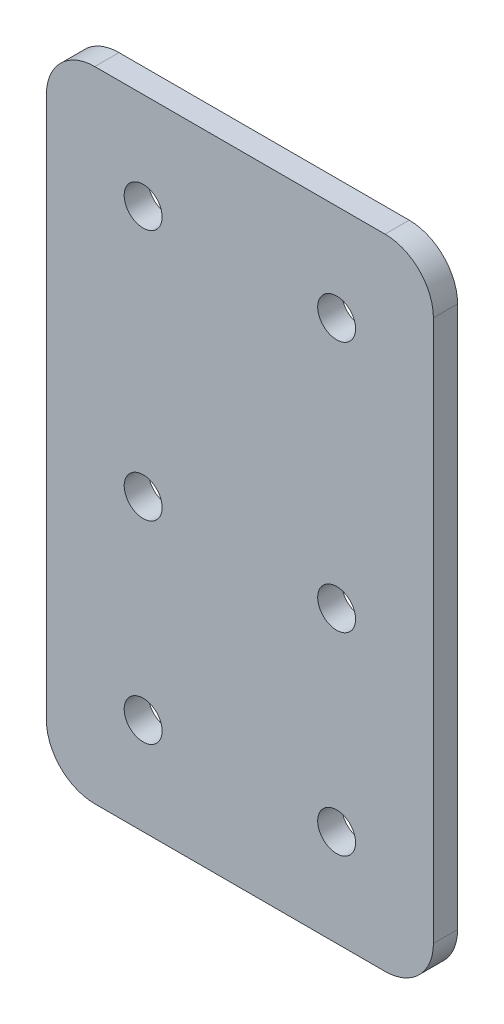
ISO-10303-21;
HEADER;
FILE_DESCRIPTION(('STEP AP214'),'2;1');
FILE_NAME('part.step','',(''),(''),'','','');
FILE_SCHEMA(('AUTOMOTIVE_DESIGN { 1 0 10303 214 1 1 1 1 }'));
ENDSEC;
DATA;
#1=APPLICATION_CONTEXT('core data for automotive mechanical design processes');
#2=APPLICATION_PROTOCOL_DEFINITION('international standard','automotive_design',2000,#1);
#3=PRODUCT_CONTEXT('',#1,'mechanical');
#4=PRODUCT('Part','Part','',(#3));
#5=PRODUCT_RELATED_PRODUCT_CATEGORY('part','',(#4));
#6=PRODUCT_DEFINITION_FORMATION('','',#4);
#7=PRODUCT_DEFINITION_CONTEXT('part definition',#1,'design');
#8=PRODUCT_DEFINITION('design','',#6,#7);
#9=PRODUCT_DEFINITION_SHAPE('','',#8);
#10=(LENGTH_UNIT() NAMED_UNIT(*) SI_UNIT(.MILLI.,.METRE.));
#11=(NAMED_UNIT(*) PLANE_ANGLE_UNIT() SI_UNIT($,.RADIAN.));
#12=(NAMED_UNIT(*) SI_UNIT($,.STERADIAN.) SOLID_ANGLE_UNIT());
#13=UNCERTAINTY_MEASURE_WITH_UNIT(LENGTH_MEASURE(1.E-05),#10,'distance_accuracy_value','');
#14=(GEOMETRIC_REPRESENTATION_CONTEXT(3) GLOBAL_UNCERTAINTY_ASSIGNED_CONTEXT((#13)) GLOBAL_UNIT_ASSIGNED_CONTEXT((#10,
#11,#12)) REPRESENTATION_CONTEXT('',''));
#15=CARTESIAN_POINT('',(0.,0.,0.));
#16=DIRECTION('',(0.,0.,1.));
#17=DIRECTION('',(1.,0.,0.));
#18=AXIS2_PLACEMENT_3D('',#15,#16,#17);
#19=CARTESIAN_POINT('',(0.,0.,-3.175));
#20=DIRECTION('',(-1.,0.,0.));
#21=DIRECTION('',(0.,0.,1.));
#22=AXIS2_PLACEMENT_3D('',#19,#20,#21);
#23=PLANE('',#22);
#24=DIRECTION('',(0.,-1.,0.));
#25=VECTOR('',#24,1.);
#26=CARTESIAN_POINT('',(0.,0.,-3.175));
#27=LINE('',#26,#25);
#28=CARTESIAN_POINT('',(0.,77.47,-3.175));
#29=VERTEX_POINT('',#28);
#30=CARTESIAN_POINT('',(0.,6.35,-3.175));
#31=VERTEX_POINT('',#30);
#32=EDGE_CURVE('E196',#29,#31,#27,.T.);
#33=ORIENTED_EDGE('',*,*,#32,.T.);
#34=DIRECTION('',(0.,0.,1.));
#35=VECTOR('',#34,1.);
#36=CARTESIAN_POINT('',(0.,6.35,-3.175));
#37=LINE('',#36,#35);
#38=CARTESIAN_POINT('',(0.,6.35,0.));
#39=VERTEX_POINT('',#38);
#40=EDGE_CURVE('E132',#31,#39,#37,.T.);
#41=ORIENTED_EDGE('',*,*,#40,.T.);
#42=DIRECTION('',(0.,-1.,0.));
#43=VECTOR('',#42,1.);
#44=CARTESIAN_POINT('',(0.,0.,0.));
#45=LINE('',#44,#43);
#46=CARTESIAN_POINT('',(0.,77.47,0.));
#47=VERTEX_POINT('',#46);
#48=EDGE_CURVE('E116',#47,#39,#45,.T.);
#49=ORIENTED_EDGE('',*,*,#48,.F.);
#50=DIRECTION('',(0.,0.,1.));
#51=VECTOR('',#50,1.);
#52=CARTESIAN_POINT('',(0.,77.47,-3.175));
#53=LINE('',#52,#51);
#54=EDGE_CURVE('E129',#47,#29,#53,.F.);
#55=ORIENTED_EDGE('',*,*,#54,.T.);
#56=EDGE_LOOP('',(#33,#41,#49,#55));
#57=FACE_BOUND('',#56,.T.);
#58=ADVANCED_FACE('F45',(#57),#23,.T.);
#59=CARTESIAN_POINT('',(0.,83.82,-3.175));
#60=DIRECTION('',(0.,1.,0.));
#61=DIRECTION('',(0.,0.,1.));
#62=AXIS2_PLACEMENT_3D('',#59,#60,#61);
#63=PLANE('',#62);
#64=DIRECTION('',(-1.,0.,0.));
#65=VECTOR('',#64,1.);
#66=CARTESIAN_POINT('',(0.,83.82,-3.175));
#67=LINE('',#66,#65);
#68=CARTESIAN_POINT('',(44.45,83.82,-3.175));
#69=VERTEX_POINT('',#68);
#70=CARTESIAN_POINT('',(6.35,83.82,-3.175));
#71=VERTEX_POINT('',#70);
#72=EDGE_CURVE('E141',#69,#71,#67,.T.);
#73=ORIENTED_EDGE('',*,*,#72,.T.);
#74=DIRECTION('',(0.,0.,1.));
#75=VECTOR('',#74,1.);
#76=CARTESIAN_POINT('',(6.35,83.82,-3.175));
#77=LINE('',#76,#75);
#78=CARTESIAN_POINT('',(6.35,83.82,0.));
#79=VERTEX_POINT('',#78);
#80=EDGE_CURVE('E11',#71,#79,#77,.T.);
#81=ORIENTED_EDGE('',*,*,#80,.T.);
#82=DIRECTION('',(-1.,0.,0.));
#83=VECTOR('',#82,1.);
#84=CARTESIAN_POINT('',(0.,83.82,0.));
#85=LINE('',#84,#83);
#86=CARTESIAN_POINT('',(44.45,83.82,0.));
#87=VERTEX_POINT('',#86);
#88=EDGE_CURVE('E118',#87,#79,#85,.T.);
#89=ORIENTED_EDGE('',*,*,#88,.F.);
#90=DIRECTION('',(0.,0.,1.));
#91=VECTOR('',#90,1.);
#92=CARTESIAN_POINT('',(44.45,83.82,-3.175));
#93=LINE('',#92,#91);
#94=EDGE_CURVE('E54',#87,#69,#93,.F.);
#95=ORIENTED_EDGE('',*,*,#94,.T.);
#96=EDGE_LOOP('',(#73,#81,#89,#95));
#97=FACE_BOUND('',#96,.T.);
#98=ADVANCED_FACE('F184',(#97),#63,.T.);
#99=CARTESIAN_POINT('',(50.8,83.82,-3.175));
#100=DIRECTION('',(1.,0.,0.));
#101=DIRECTION('',(0.,1.,0.));
#102=AXIS2_PLACEMENT_3D('',#99,#100,#101);
#103=PLANE('',#102);
#104=DIRECTION('',(0.,1.,0.));
#105=VECTOR('',#104,1.);
#106=CARTESIAN_POINT('',(50.8,83.82,0.));
#107=LINE('',#106,#105);
#108=CARTESIAN_POINT('',(50.8,6.34999999999999,0.));
#109=VERTEX_POINT('',#108);
#110=CARTESIAN_POINT('',(50.8,77.47,0.));
#111=VERTEX_POINT('',#110);
#112=EDGE_CURVE('E191',#109,#111,#107,.T.);
#113=ORIENTED_EDGE('',*,*,#112,.F.);
#114=DIRECTION('',(0.,0.,1.));
#115=VECTOR('',#114,1.);
#116=CARTESIAN_POINT('',(50.8,6.34999999999999,-3.175));
#117=LINE('',#116,#115);
#118=CARTESIAN_POINT('',(50.8,6.34999999999999,-3.175));
#119=VERTEX_POINT('',#118);
#120=EDGE_CURVE('E68',#109,#119,#117,.F.);
#121=ORIENTED_EDGE('',*,*,#120,.T.);
#122=DIRECTION('',(0.,1.,0.));
#123=VECTOR('',#122,1.);
#124=CARTESIAN_POINT('',(50.8,83.82,-3.175));
#125=LINE('',#124,#123);
#126=CARTESIAN_POINT('',(50.8,77.47,-3.175));
#127=VERTEX_POINT('',#126);
#128=EDGE_CURVE('E147',#119,#127,#125,.T.);
#129=ORIENTED_EDGE('',*,*,#128,.T.);
#130=DIRECTION('',(0.,0.,1.));
#131=VECTOR('',#130,1.);
#132=CARTESIAN_POINT('',(50.8,77.47,-3.175));
#133=LINE('',#132,#131);
#134=EDGE_CURVE('E176',#127,#111,#133,.T.);
#135=ORIENTED_EDGE('',*,*,#134,.T.);
#136=EDGE_LOOP('',(#113,#121,#129,#135));
#137=FACE_BOUND('',#136,.T.);
#138=ADVANCED_FACE('F190',(#137),#103,.T.);
#139=CARTESIAN_POINT('',(0.,0.,-3.175));
#140=DIRECTION('',(0.,-1.,0.));
#141=DIRECTION('',(0.,0.,-1.));
#142=AXIS2_PLACEMENT_3D('',#139,#140,#141);
#143=PLANE('',#142);
#144=DIRECTION('',(1.,0.,0.));
#145=VECTOR('',#144,1.);
#146=CARTESIAN_POINT('',(0.,0.,0.));
#147=LINE('',#146,#145);
#148=CARTESIAN_POINT('',(6.35,0.,0.));
#149=VERTEX_POINT('',#148);
#150=CARTESIAN_POINT('',(44.45,0.,0.));
#151=VERTEX_POINT('',#150);
#152=EDGE_CURVE('E134',#149,#151,#147,.T.);
#153=ORIENTED_EDGE('',*,*,#152,.F.);
#154=DIRECTION('',(0.,0.,1.));
#155=VECTOR('',#154,1.);
#156=CARTESIAN_POINT('',(6.35,0.,-3.175));
#157=LINE('',#156,#155);
#158=CARTESIAN_POINT('',(6.35,0.,-3.175));
#159=VERTEX_POINT('',#158);
#160=EDGE_CURVE('E163',#149,#159,#157,.F.);
#161=ORIENTED_EDGE('',*,*,#160,.T.);
#162=DIRECTION('',(1.,0.,0.));
#163=VECTOR('',#162,1.);
#164=CARTESIAN_POINT('',(0.,0.,-3.175));
#165=LINE('',#164,#163);
#166=CARTESIAN_POINT('',(44.45,0.,-3.175));
#167=VERTEX_POINT('',#166);
#168=EDGE_CURVE('E201',#159,#167,#165,.T.);
#169=ORIENTED_EDGE('',*,*,#168,.T.);
#170=DIRECTION('',(0.,0.,1.));
#171=VECTOR('',#170,1.);
#172=CARTESIAN_POINT('',(44.45,0.,-3.175));
#173=LINE('',#172,#171);
#174=EDGE_CURVE('E159',#167,#151,#173,.T.);
#175=ORIENTED_EDGE('',*,*,#174,.T.);
#176=EDGE_LOOP('',(#153,#161,#169,#175));
#177=FACE_BOUND('',#176,.T.);
#178=ADVANCED_FACE('F287',(#177),#143,.T.);
#179=CARTESIAN_POINT('',(0.,0.,-3.175));
#180=DIRECTION('',(0.,0.,-1.));
#181=DIRECTION('',(-1.,0.,0.));
#182=AXIS2_PLACEMENT_3D('',#179,#180,#181);
#183=PLANE('',#182);
#184=CARTESIAN_POINT('',(38.1,12.7,-3.175));
#185=DIRECTION('',(0.,0.,1.));
#186=DIRECTION('',(1.,0.,0.));
#187=AXIS2_PLACEMENT_3D('',#184,#185,#186);
#188=CIRCLE('',#187,2.4892);
#189=CARTESIAN_POINT('',(40.5892,12.7,-3.175));
#190=VERTEX_POINT('',#189);
#191=EDGE_CURVE('E231',#190,#190,#188,.T.);
#192=ORIENTED_EDGE('',*,*,#191,.T.);
#193=EDGE_LOOP('',(#192));
#194=FACE_BOUND('',#193,.T.);
#195=CARTESIAN_POINT('',(12.7,12.7,-3.175));
#196=DIRECTION('',(0.,0.,1.));
#197=DIRECTION('',(1.,0.,0.));
#198=AXIS2_PLACEMENT_3D('',#195,#196,#197);
#199=CIRCLE('',#198,2.4892);
#200=CARTESIAN_POINT('',(15.1892,12.7,-3.175));
#201=VERTEX_POINT('',#200);
#202=EDGE_CURVE('E215',#201,#201,#199,.T.);
#203=ORIENTED_EDGE('',*,*,#202,.T.);
#204=EDGE_LOOP('',(#203));
#205=FACE_BOUND('',#204,.T.);
#206=CARTESIAN_POINT('',(12.7,38.1,-3.175));
#207=DIRECTION('',(0.,0.,1.));
#208=DIRECTION('',(1.,0.,0.));
#209=AXIS2_PLACEMENT_3D('',#206,#207,#208);
#210=CIRCLE('',#209,2.48919999999999);
#211=CARTESIAN_POINT('',(15.1892,38.1,-3.175));
#212=VERTEX_POINT('',#211);
#213=EDGE_CURVE('E224',#212,#212,#210,.T.);
#214=ORIENTED_EDGE('',*,*,#213,.T.);
#215=EDGE_LOOP('',(#214));
#216=FACE_BOUND('',#215,.T.);
#217=CARTESIAN_POINT('',(38.1,38.1,-3.175));
#218=DIRECTION('',(0.,0.,1.));
#219=DIRECTION('',(1.,0.,0.));
#220=AXIS2_PLACEMENT_3D('',#217,#218,#219);
#221=CIRCLE('',#220,2.4892);
#222=CARTESIAN_POINT('',(40.5892,38.1,-3.175));
#223=VERTEX_POINT('',#222);
#224=EDGE_CURVE('E247',#223,#223,#221,.T.);
#225=ORIENTED_EDGE('',*,*,#224,.T.);
#226=EDGE_LOOP('',(#225));
#227=FACE_BOUND('',#226,.T.);
#228=CARTESIAN_POINT('',(38.1,71.12,-3.175));
#229=DIRECTION('',(0.,0.,1.));
#230=DIRECTION('',(1.,0.,0.));
#231=AXIS2_PLACEMENT_3D('',#228,#229,#230);
#232=CIRCLE('',#231,2.4892);
#233=CARTESIAN_POINT('',(40.5892,71.12,-3.175));
#234=VERTEX_POINT('',#233);
#235=EDGE_CURVE('E239',#234,#234,#232,.T.);
#236=ORIENTED_EDGE('',*,*,#235,.T.);
#237=EDGE_LOOP('',(#236));
#238=FACE_BOUND('',#237,.T.);
#239=CARTESIAN_POINT('',(12.7,71.12,-3.175));
#240=DIRECTION('',(0.,0.,1.));
#241=DIRECTION('',(1.,0.,0.));
#242=AXIS2_PLACEMENT_3D('',#239,#240,#241);
#243=CIRCLE('',#242,2.48919999999999);
#244=CARTESIAN_POINT('',(15.1892,71.12,-3.175));
#245=VERTEX_POINT('',#244);
#246=EDGE_CURVE('E135',#245,#245,#243,.T.);
#247=ORIENTED_EDGE('',*,*,#246,.T.);
#248=EDGE_LOOP('',(#247));
#249=FACE_BOUND('',#248,.T.);
#250=ORIENTED_EDGE('',*,*,#168,.F.);
#251=CARTESIAN_POINT('',(6.35,6.35,-3.175));
#252=DIRECTION('',(0.,0.,-1.));
#253=DIRECTION('',(-1.,0.,0.));
#254=AXIS2_PLACEMENT_3D('',#251,#252,#253);
#255=CIRCLE('',#254,6.35);
#256=EDGE_CURVE('E173',#159,#31,#255,.T.);
#257=ORIENTED_EDGE('',*,*,#256,.T.);
#258=ORIENTED_EDGE('',*,*,#32,.F.);
#259=CARTESIAN_POINT('',(6.35,77.47,-3.175));
#260=DIRECTION('',(0.,0.,-1.));
#261=DIRECTION('',(-1.,0.,0.));
#262=AXIS2_PLACEMENT_3D('',#259,#260,#261);
#263=CIRCLE('',#262,6.35);
#264=EDGE_CURVE('E139',#29,#71,#263,.T.);
#265=ORIENTED_EDGE('',*,*,#264,.T.);
#266=ORIENTED_EDGE('',*,*,#72,.F.);
#267=CARTESIAN_POINT('',(44.45,77.47,-3.175));
#268=DIRECTION('',(0.,0.,-1.));
#269=DIRECTION('',(-1.,0.,0.));
#270=AXIS2_PLACEMENT_3D('',#267,#268,#269);
#271=CIRCLE('',#270,6.35);
#272=EDGE_CURVE('E61',#69,#127,#271,.T.);
#273=ORIENTED_EDGE('',*,*,#272,.T.);
#274=ORIENTED_EDGE('',*,*,#128,.F.);
#275=CARTESIAN_POINT('',(44.45,6.35,-3.175));
#276=DIRECTION('',(0.,0.,-1.));
#277=DIRECTION('',(-1.,0.,0.));
#278=AXIS2_PLACEMENT_3D('',#275,#276,#277);
#279=CIRCLE('',#278,6.35);
#280=EDGE_CURVE('E170',#119,#167,#279,.T.);
#281=ORIENTED_EDGE('',*,*,#280,.T.);
#282=EDGE_LOOP('',(#250,#257,#258,#265,#266,#273,#274,#281));
#283=FACE_BOUND('',#282,.T.);
#284=ADVANCED_FACE('F187',(#194,#205,#216,#227,#238,#249,#283),#183,.T.);
#285=CARTESIAN_POINT('',(0.,0.,0.));
#286=DIRECTION('',(0.,0.,-1.));
#287=DIRECTION('',(-1.,0.,0.));
#288=AXIS2_PLACEMENT_3D('',#285,#286,#287);
#289=PLANE('',#288);
#290=CARTESIAN_POINT('',(38.1,12.7,0.));
#291=DIRECTION('',(0.,0.,1.));
#292=DIRECTION('',(1.,0.,0.));
#293=AXIS2_PLACEMENT_3D('',#290,#291,#292);
#294=CIRCLE('',#293,2.4892);
#295=CARTESIAN_POINT('',(40.5892,12.7,0.));
#296=VERTEX_POINT('',#295);
#297=EDGE_CURVE('E220',#296,#296,#294,.T.);
#298=ORIENTED_EDGE('',*,*,#297,.F.);
#299=EDGE_LOOP('',(#298));
#300=FACE_BOUND('',#299,.T.);
#301=CARTESIAN_POINT('',(12.7,12.7,0.));
#302=DIRECTION('',(0.,0.,1.));
#303=DIRECTION('',(1.,0.,0.));
#304=AXIS2_PLACEMENT_3D('',#301,#302,#303);
#305=CIRCLE('',#304,2.4892);
#306=CARTESIAN_POINT('',(15.1892,12.7,0.));
#307=VERTEX_POINT('',#306);
#308=EDGE_CURVE('E219',#307,#307,#305,.T.);
#309=ORIENTED_EDGE('',*,*,#308,.F.);
#310=EDGE_LOOP('',(#309));
#311=FACE_BOUND('',#310,.T.);
#312=CARTESIAN_POINT('',(12.7,38.1,0.));
#313=DIRECTION('',(0.,0.,1.));
#314=DIRECTION('',(1.,0.,0.));
#315=AXIS2_PLACEMENT_3D('',#312,#313,#314);
#316=CIRCLE('',#315,2.48919999999999);
#317=CARTESIAN_POINT('',(15.1892,38.1,0.));
#318=VERTEX_POINT('',#317);
#319=EDGE_CURVE('E211',#318,#318,#316,.T.);
#320=ORIENTED_EDGE('',*,*,#319,.F.);
#321=EDGE_LOOP('',(#320));
#322=FACE_BOUND('',#321,.T.);
#323=CARTESIAN_POINT('',(38.1,38.1,0.));
#324=DIRECTION('',(0.,0.,1.));
#325=DIRECTION('',(1.,0.,0.));
#326=AXIS2_PLACEMENT_3D('',#323,#324,#325);
#327=CIRCLE('',#326,2.4892);
#328=CARTESIAN_POINT('',(40.5892,38.1,0.));
#329=VERTEX_POINT('',#328);
#330=EDGE_CURVE('E243',#329,#329,#327,.T.);
#331=ORIENTED_EDGE('',*,*,#330,.F.);
#332=EDGE_LOOP('',(#331));
#333=FACE_BOUND('',#332,.T.);
#334=CARTESIAN_POINT('',(38.1,71.12,0.));
#335=DIRECTION('',(0.,0.,1.));
#336=DIRECTION('',(1.,0.,0.));
#337=AXIS2_PLACEMENT_3D('',#334,#335,#336);
#338=CIRCLE('',#337,2.4892);
#339=CARTESIAN_POINT('',(40.5892,71.12,0.));
#340=VERTEX_POINT('',#339);
#341=EDGE_CURVE('E235',#340,#340,#338,.T.);
#342=ORIENTED_EDGE('',*,*,#341,.F.);
#343=EDGE_LOOP('',(#342));
#344=FACE_BOUND('',#343,.T.);
#345=CARTESIAN_POINT('',(12.7,71.12,0.));
#346=DIRECTION('',(0.,0.,1.));
#347=DIRECTION('',(1.,0.,0.));
#348=AXIS2_PLACEMENT_3D('',#345,#346,#347);
#349=CIRCLE('',#348,2.48919999999999);
#350=CARTESIAN_POINT('',(15.1892,71.12,0.));
#351=VERTEX_POINT('',#350);
#352=EDGE_CURVE('E207',#351,#351,#349,.T.);
#353=ORIENTED_EDGE('',*,*,#352,.F.);
#354=EDGE_LOOP('',(#353));
#355=FACE_BOUND('',#354,.T.);
#356=ORIENTED_EDGE('',*,*,#48,.T.);
#357=CARTESIAN_POINT('',(6.35,6.35,0.));
#358=DIRECTION('',(0.,0.,-1.));
#359=DIRECTION('',(-1.,0.,0.));
#360=AXIS2_PLACEMENT_3D('',#357,#358,#359);
#361=CIRCLE('',#360,6.35);
#362=EDGE_CURVE('E156',#39,#149,#361,.F.);
#363=ORIENTED_EDGE('',*,*,#362,.T.);
#364=ORIENTED_EDGE('',*,*,#152,.T.);
#365=CARTESIAN_POINT('',(44.45,6.35,0.));
#366=DIRECTION('',(0.,0.,-1.));
#367=DIRECTION('',(-1.,0.,0.));
#368=AXIS2_PLACEMENT_3D('',#365,#366,#367);
#369=CIRCLE('',#368,6.35);
#370=EDGE_CURVE('E123',#151,#109,#369,.F.);
#371=ORIENTED_EDGE('',*,*,#370,.T.);
#372=ORIENTED_EDGE('',*,*,#112,.T.);
#373=CARTESIAN_POINT('',(44.45,77.47,0.));
#374=DIRECTION('',(0.,0.,-1.));
#375=DIRECTION('',(-1.,0.,0.));
#376=AXIS2_PLACEMENT_3D('',#373,#374,#375);
#377=CIRCLE('',#376,6.35);
#378=EDGE_CURVE('E124',#111,#87,#377,.F.);
#379=ORIENTED_EDGE('',*,*,#378,.T.);
#380=ORIENTED_EDGE('',*,*,#88,.T.);
#381=CARTESIAN_POINT('',(6.35,77.47,0.));
#382=DIRECTION('',(0.,0.,-1.));
#383=DIRECTION('',(-1.,0.,0.));
#384=AXIS2_PLACEMENT_3D('',#381,#382,#383);
#385=CIRCLE('',#384,6.35);
#386=EDGE_CURVE('E113',#79,#47,#385,.F.);
#387=ORIENTED_EDGE('',*,*,#386,.T.);
#388=EDGE_LOOP('',(#356,#363,#364,#371,#372,#379,#380,#387));
#389=FACE_BOUND('',#388,.T.);
#390=ADVANCED_FACE('F115',(#300,#311,#322,#333,#344,#355,#389),#289,.F.);
#391=CARTESIAN_POINT('',(12.7,71.12,-3.175));
#392=DIRECTION('',(0.,0.,1.));
#393=DIRECTION('',(1.,0.,0.));
#394=AXIS2_PLACEMENT_3D('',#391,#392,#393);
#395=CYLINDRICAL_SURFACE('',#394,2.48919999999999);
#396=ORIENTED_EDGE('',*,*,#246,.F.);
#397=EDGE_LOOP('',(#396));
#398=FACE_BOUND('',#397,.T.);
#399=ORIENTED_EDGE('',*,*,#352,.T.);
#400=EDGE_LOOP('',(#399));
#401=FACE_BOUND('',#400,.T.);
#402=ADVANCED_FACE('F259',(#398,#401),#395,.F.);
#403=CARTESIAN_POINT('',(38.1,71.12,-3.175));
#404=DIRECTION('',(0.,0.,1.));
#405=DIRECTION('',(1.,0.,0.));
#406=AXIS2_PLACEMENT_3D('',#403,#404,#405);
#407=CYLINDRICAL_SURFACE('',#406,2.4892);
#408=ORIENTED_EDGE('',*,*,#235,.F.);
#409=EDGE_LOOP('',(#408));
#410=FACE_BOUND('',#409,.T.);
#411=ORIENTED_EDGE('',*,*,#341,.T.);
#412=EDGE_LOOP('',(#411));
#413=FACE_BOUND('',#412,.T.);
#414=ADVANCED_FACE('F267',(#410,#413),#407,.F.);
#415=CARTESIAN_POINT('',(38.1,38.1,-3.175));
#416=DIRECTION('',(0.,0.,1.));
#417=DIRECTION('',(1.,0.,0.));
#418=AXIS2_PLACEMENT_3D('',#415,#416,#417);
#419=CYLINDRICAL_SURFACE('',#418,2.4892);
#420=ORIENTED_EDGE('',*,*,#224,.F.);
#421=EDGE_LOOP('',(#420));
#422=FACE_BOUND('',#421,.T.);
#423=ORIENTED_EDGE('',*,*,#330,.T.);
#424=EDGE_LOOP('',(#423));
#425=FACE_BOUND('',#424,.T.);
#426=ADVANCED_FACE('F255',(#422,#425),#419,.F.);
#427=CARTESIAN_POINT('',(12.7,38.1,-3.175));
#428=DIRECTION('',(0.,0.,1.));
#429=DIRECTION('',(1.,0.,0.));
#430=AXIS2_PLACEMENT_3D('',#427,#428,#429);
#431=CYLINDRICAL_SURFACE('',#430,2.48919999999999);
#432=ORIENTED_EDGE('',*,*,#213,.F.);
#433=EDGE_LOOP('',(#432));
#434=FACE_BOUND('',#433,.T.);
#435=ORIENTED_EDGE('',*,*,#319,.T.);
#436=EDGE_LOOP('',(#435));
#437=FACE_BOUND('',#436,.T.);
#438=ADVANCED_FACE('F338',(#434,#437),#431,.F.);
#439=CARTESIAN_POINT('',(12.7,12.7,-3.175));
#440=DIRECTION('',(0.,0.,1.));
#441=DIRECTION('',(1.,0.,0.));
#442=AXIS2_PLACEMENT_3D('',#439,#440,#441);
#443=CYLINDRICAL_SURFACE('',#442,2.4892);
#444=ORIENTED_EDGE('',*,*,#202,.F.);
#445=EDGE_LOOP('',(#444));
#446=FACE_BOUND('',#445,.T.);
#447=ORIENTED_EDGE('',*,*,#308,.T.);
#448=EDGE_LOOP('',(#447));
#449=FACE_BOUND('',#448,.T.);
#450=ADVANCED_FACE('F328',(#446,#449),#443,.F.);
#451=CARTESIAN_POINT('',(38.1,12.7,-3.175));
#452=DIRECTION('',(0.,0.,1.));
#453=DIRECTION('',(1.,0.,0.));
#454=AXIS2_PLACEMENT_3D('',#451,#452,#453);
#455=CYLINDRICAL_SURFACE('',#454,2.4892);
#456=ORIENTED_EDGE('',*,*,#191,.F.);
#457=EDGE_LOOP('',(#456));
#458=FACE_BOUND('',#457,.T.);
#459=ORIENTED_EDGE('',*,*,#297,.T.);
#460=EDGE_LOOP('',(#459));
#461=FACE_BOUND('',#460,.T.);
#462=ADVANCED_FACE('F293',(#458,#461),#455,.F.);
#463=CARTESIAN_POINT('',(6.35,6.35,-3.175));
#464=DIRECTION('',(0.,0.,1.));
#465=DIRECTION('',(1.,0.,0.));
#466=AXIS2_PLACEMENT_3D('',#463,#464,#465);
#467=CYLINDRICAL_SURFACE('',#466,6.35);
#468=ORIENTED_EDGE('',*,*,#256,.F.);
#469=ORIENTED_EDGE('',*,*,#160,.F.);
#470=ORIENTED_EDGE('',*,*,#362,.F.);
#471=ORIENTED_EDGE('',*,*,#40,.F.);
#472=EDGE_LOOP('',(#468,#469,#470,#471));
#473=FACE_BOUND('',#472,.T.);
#474=ADVANCED_FACE('F289',(#473),#467,.T.);
#475=CARTESIAN_POINT('',(44.45,6.35,-3.175));
#476=DIRECTION('',(0.,0.,1.));
#477=DIRECTION('',(1.,0.,0.));
#478=AXIS2_PLACEMENT_3D('',#475,#476,#477);
#479=CYLINDRICAL_SURFACE('',#478,6.35);
#480=ORIENTED_EDGE('',*,*,#280,.F.);
#481=ORIENTED_EDGE('',*,*,#120,.F.);
#482=ORIENTED_EDGE('',*,*,#370,.F.);
#483=ORIENTED_EDGE('',*,*,#174,.F.);
#484=EDGE_LOOP('',(#480,#481,#482,#483));
#485=FACE_BOUND('',#484,.T.);
#486=ADVANCED_FACE('F292',(#485),#479,.T.);
#487=CARTESIAN_POINT('',(6.35,77.47,-3.175));
#488=DIRECTION('',(0.,0.,1.));
#489=DIRECTION('',(1.,0.,0.));
#490=AXIS2_PLACEMENT_3D('',#487,#488,#489);
#491=CYLINDRICAL_SURFACE('',#490,6.35);
#492=ORIENTED_EDGE('',*,*,#264,.F.);
#493=ORIENTED_EDGE('',*,*,#54,.F.);
#494=ORIENTED_EDGE('',*,*,#386,.F.);
#495=ORIENTED_EDGE('',*,*,#80,.F.);
#496=EDGE_LOOP('',(#492,#493,#494,#495));
#497=FACE_BOUND('',#496,.T.);
#498=ADVANCED_FACE('F138',(#497),#491,.T.);
#499=CARTESIAN_POINT('',(44.45,77.47,-3.175));
#500=DIRECTION('',(0.,0.,1.));
#501=DIRECTION('',(1.,0.,0.));
#502=AXIS2_PLACEMENT_3D('',#499,#500,#501);
#503=CYLINDRICAL_SURFACE('',#502,6.35);
#504=ORIENTED_EDGE('',*,*,#272,.F.);
#505=ORIENTED_EDGE('',*,*,#94,.F.);
#506=ORIENTED_EDGE('',*,*,#378,.F.);
#507=ORIENTED_EDGE('',*,*,#134,.F.);
#508=EDGE_LOOP('',(#504,#505,#506,#507));
#509=FACE_BOUND('',#508,.T.);
#510=ADVANCED_FACE('F47',(#509),#503,.T.);
#511=CLOSED_SHELL('',(#58,#98,#138,#178,#284,#390,#402,#414,#426,#438,#450,#462,#474,#486,#498,#510));
#512=MANIFOLD_SOLID_BREP('B2',#511);
#513=ADVANCED_BREP_SHAPE_REPRESENTATION('',(#18,#512),#14);
#514=SHAPE_DEFINITION_REPRESENTATION(#9,#513);
ENDSEC;
END-ISO-10303-21;
